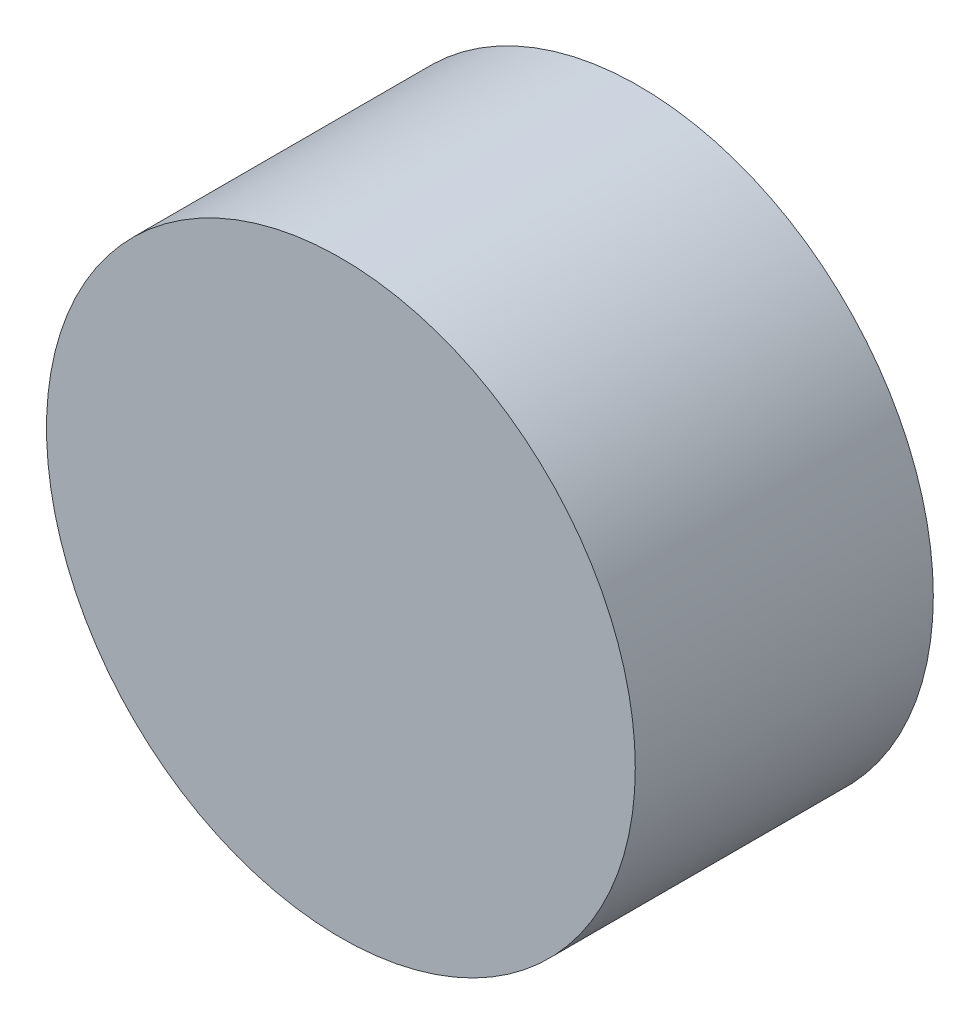
ISO-10303-21;
HEADER;
FILE_DESCRIPTION(('STEP AP214'),'2;1');
FILE_NAME('part.step','',(''),(''),'','','');
FILE_SCHEMA(('AUTOMOTIVE_DESIGN { 1 0 10303 214 1 1 1 1 }'));
ENDSEC;
DATA;
#1=APPLICATION_CONTEXT('core data for automotive mechanical design processes');
#2=APPLICATION_PROTOCOL_DEFINITION('international standard','automotive_design',2000,#1);
#3=PRODUCT_CONTEXT('',#1,'mechanical');
#4=PRODUCT('Part','Part','',(#3));
#5=PRODUCT_RELATED_PRODUCT_CATEGORY('part','',(#4));
#6=PRODUCT_DEFINITION_FORMATION('','',#4);
#7=PRODUCT_DEFINITION_CONTEXT('part definition',#1,'design');
#8=PRODUCT_DEFINITION('design','',#6,#7);
#9=PRODUCT_DEFINITION_SHAPE('','',#8);
#10=(LENGTH_UNIT() NAMED_UNIT(*) SI_UNIT(.MILLI.,.METRE.));
#11=(NAMED_UNIT(*) PLANE_ANGLE_UNIT() SI_UNIT($,.RADIAN.));
#12=(NAMED_UNIT(*) SI_UNIT($,.STERADIAN.) SOLID_ANGLE_UNIT());
#13=UNCERTAINTY_MEASURE_WITH_UNIT(LENGTH_MEASURE(1.E-05),#10,'distance_accuracy_value','');
#14=(GEOMETRIC_REPRESENTATION_CONTEXT(3) GLOBAL_UNCERTAINTY_ASSIGNED_CONTEXT((#13)) GLOBAL_UNIT_ASSIGNED_CONTEXT((#10,
#11,#12)) REPRESENTATION_CONTEXT('',''));
#15=CARTESIAN_POINT('',(0.,0.,0.));
#16=DIRECTION('',(0.,0.,1.));
#17=DIRECTION('',(1.,0.,0.));
#18=AXIS2_PLACEMENT_3D('',#15,#16,#17);
#19=CARTESIAN_POINT('',(0.,0.,10.1234567891235));
#20=DIRECTION('',(0.,0.,-1.));
#21=DIRECTION('',(-1.,0.,0.));
#22=AXIS2_PLACEMENT_3D('',#19,#20,#21);
#23=CYLINDRICAL_SURFACE('',#22,10.);
#24=CARTESIAN_POINT('',(0.,0.,10.1234567891235));
#25=DIRECTION('',(0.,0.,1.));
#26=DIRECTION('',(1.,0.,0.));
#27=AXIS2_PLACEMENT_3D('',#24,#25,#26);
#28=CIRCLE('',#27,10.);
#29=CARTESIAN_POINT('',(10.,0.,10.1234567891235));
#30=VERTEX_POINT('',#29);
#31=EDGE_CURVE('E10',#30,#30,#28,.T.);
#32=ORIENTED_EDGE('',*,*,#31,.F.);
#33=EDGE_LOOP('',(#32));
#34=FACE_BOUND('',#33,.T.);
#35=CARTESIAN_POINT('',(0.,0.,0.));
#36=DIRECTION('',(0.,0.,1.));
#37=DIRECTION('',(1.,0.,0.));
#38=AXIS2_PLACEMENT_3D('',#35,#36,#37);
#39=CIRCLE('',#38,10.);
#40=CARTESIAN_POINT('',(10.,0.,0.));
#41=VERTEX_POINT('',#40);
#42=EDGE_CURVE('E34',#41,#41,#39,.T.);
#43=ORIENTED_EDGE('',*,*,#42,.T.);
#44=EDGE_LOOP('',(#43));
#45=FACE_BOUND('',#44,.T.);
#46=ADVANCED_FACE('F31',(#34,#45),#23,.T.);
#47=CARTESIAN_POINT('',(0.,0.,10.1234567891235));
#48=DIRECTION('',(0.,0.,1.));
#49=DIRECTION('',(1.,0.,0.));
#50=AXIS2_PLACEMENT_3D('',#47,#48,#49);
#51=PLANE('',#50);
#52=ORIENTED_EDGE('',*,*,#31,.T.);
#53=EDGE_LOOP('',(#52));
#54=FACE_BOUND('',#53,.T.);
#55=ADVANCED_FACE('F46',(#54),#51,.T.);
#56=CARTESIAN_POINT('',(0.,0.,0.));
#57=DIRECTION('',(0.,0.,1.));
#58=DIRECTION('',(1.,0.,0.));
#59=AXIS2_PLACEMENT_3D('',#56,#57,#58);
#60=PLANE('',#59);
#61=ORIENTED_EDGE('',*,*,#42,.F.);
#62=EDGE_LOOP('',(#61));
#63=FACE_BOUND('',#62,.T.);
#64=ADVANCED_FACE('F44',(#63),#60,.F.);
#65=CLOSED_SHELL('',(#46,#55,#64));
#66=MANIFOLD_SOLID_BREP('B2',#65);
#67=ADVANCED_BREP_SHAPE_REPRESENTATION('',(#18,#66),#14);
#68=SHAPE_DEFINITION_REPRESENTATION(#9,#67);
ENDSEC;
END-ISO-10303-21;
